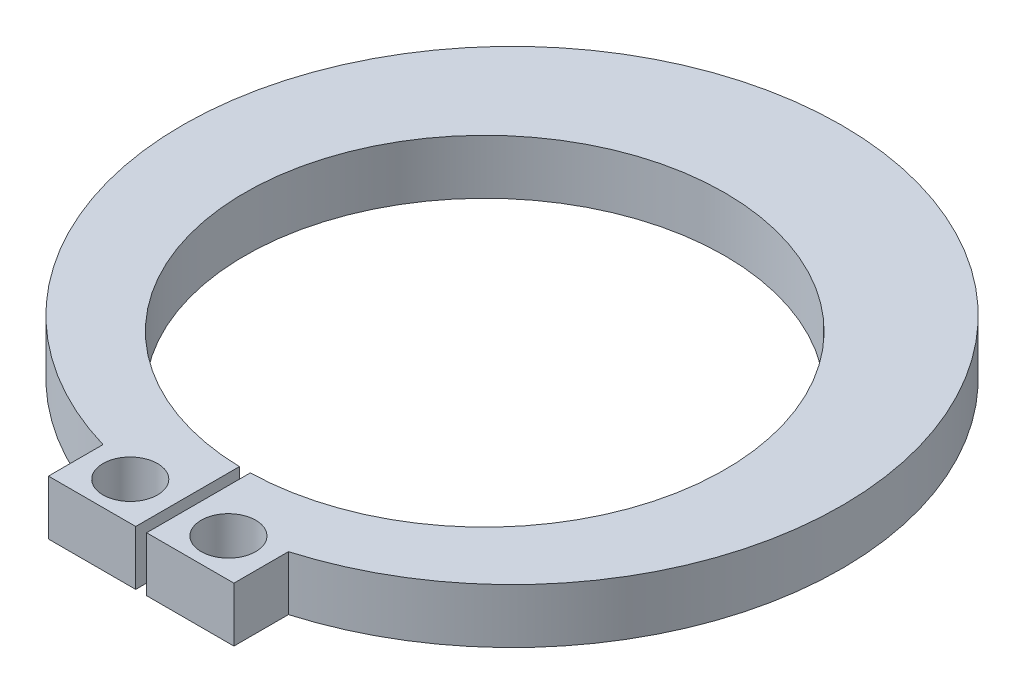
ISO-10303-21;
HEADER;
FILE_DESCRIPTION(('STEP AP214'),'2;1');
FILE_NAME('part.step','',(''),(''),'','','');
FILE_SCHEMA(('AUTOMOTIVE_DESIGN { 1 0 10303 214 1 1 1 1 }'));
ENDSEC;
DATA;
#1=APPLICATION_CONTEXT('core data for automotive mechanical design processes');
#2=APPLICATION_PROTOCOL_DEFINITION('international standard','automotive_design',2000,#1);
#3=PRODUCT_CONTEXT('',#1,'mechanical');
#4=PRODUCT('Part','Part','',(#3));
#5=PRODUCT_RELATED_PRODUCT_CATEGORY('part','',(#4));
#6=PRODUCT_DEFINITION_FORMATION('','',#4);
#7=PRODUCT_DEFINITION_CONTEXT('part definition',#1,'design');
#8=PRODUCT_DEFINITION('design','',#6,#7);
#9=PRODUCT_DEFINITION_SHAPE('','',#8);
#10=(LENGTH_UNIT() NAMED_UNIT(*) SI_UNIT(.MILLI.,.METRE.));
#11=(NAMED_UNIT(*) PLANE_ANGLE_UNIT() SI_UNIT($,.RADIAN.));
#12=(NAMED_UNIT(*) SI_UNIT($,.STERADIAN.) SOLID_ANGLE_UNIT());
#13=UNCERTAINTY_MEASURE_WITH_UNIT(LENGTH_MEASURE(1.E-05),#10,'distance_accuracy_value','');
#14=(GEOMETRIC_REPRESENTATION_CONTEXT(3) GLOBAL_UNCERTAINTY_ASSIGNED_CONTEXT((#13)) GLOBAL_UNIT_ASSIGNED_CONTEXT((#10,
#11,#12)) REPRESENTATION_CONTEXT('',''));
#15=CARTESIAN_POINT('',(0.,0.,0.));
#16=DIRECTION('',(0.,0.,1.));
#17=DIRECTION('',(1.,0.,0.));
#18=AXIS2_PLACEMENT_3D('',#15,#16,#17);
#19=CARTESIAN_POINT('',(0.,1.,0.));
#20=DIRECTION('',(0.,1.,0.));
#21=DIRECTION('',(0.,0.,1.));
#22=AXIS2_PLACEMENT_3D('',#19,#20,#21);
#23=PLANE('',#22);
#24=CARTESIAN_POINT('',(-0.9,1.,6.1));
#25=DIRECTION('',(0.,1.,0.));
#26=DIRECTION('',(0.,0.,1.));
#27=AXIS2_PLACEMENT_3D('',#24,#25,#26);
#28=CIRCLE('',#27,0.5);
#29=CARTESIAN_POINT('',(-0.9,1.,6.6));
#30=VERTEX_POINT('',#29);
#31=EDGE_CURVE('E135',#30,#30,#28,.T.);
#32=ORIENTED_EDGE('',*,*,#31,.F.);
#33=EDGE_LOOP('',(#32));
#34=FACE_BOUND('',#33,.T.);
#35=DIRECTION('',(0.,0.,1.));
#36=VECTOR('',#35,1.);
#37=CARTESIAN_POINT('',(-1.7,1.,6.8));
#38=LINE('',#37,#36);
#39=CARTESIAN_POINT('',(-1.7,1.,5.8));
#40=VERTEX_POINT('',#39);
#41=CARTESIAN_POINT('',(-1.7,1.,6.8));
#42=VERTEX_POINT('',#41);
#43=EDGE_CURVE('E146',#40,#42,#38,.T.);
#44=ORIENTED_EDGE('',*,*,#43,.T.);
#45=DIRECTION('',(1.,0.,0.));
#46=VECTOR('',#45,1.);
#47=CARTESIAN_POINT('',(-1.7,1.,6.8));
#48=LINE('',#47,#46);
#49=CARTESIAN_POINT('',(-0.1,1.,6.8));
#50=VERTEX_POINT('',#49);
#51=EDGE_CURVE('E94',#42,#50,#48,.T.);
#52=ORIENTED_EDGE('',*,*,#51,.T.);
#53=DIRECTION('',(0.,0.,-1.));
#54=VECTOR('',#53,1.);
#55=CARTESIAN_POINT('',(-0.1,1.,6.8));
#56=LINE('',#55,#54);
#57=CARTESIAN_POINT('',(-0.1,1.,4.89886348958455));
#58=VERTEX_POINT('',#57);
#59=EDGE_CURVE('E161',#50,#58,#56,.T.);
#60=ORIENTED_EDGE('',*,*,#59,.T.);
#61=CARTESIAN_POINT('',(0.,1.,0.5));
#62=DIRECTION('',(0.,-1.,0.));
#63=DIRECTION('',(0.,0.,1.));
#64=AXIS2_PLACEMENT_3D('',#61,#62,#63);
#65=CIRCLE('',#64,4.4);
#66=CARTESIAN_POINT('',(0.1,1.,4.89886348958456));
#67=VERTEX_POINT('',#66);
#68=EDGE_CURVE('E174',#58,#67,#65,.T.);
#69=ORIENTED_EDGE('',*,*,#68,.T.);
#70=DIRECTION('',(0.,0.,1.));
#71=VECTOR('',#70,1.);
#72=CARTESIAN_POINT('',(0.1,1.,6.8));
#73=LINE('',#72,#71);
#74=CARTESIAN_POINT('',(0.1,1.,6.8));
#75=VERTEX_POINT('',#74);
#76=EDGE_CURVE('E113',#67,#75,#73,.T.);
#77=ORIENTED_EDGE('',*,*,#76,.T.);
#78=DIRECTION('',(1.,0.,0.));
#79=VECTOR('',#78,1.);
#80=CARTESIAN_POINT('',(0.1,1.,6.8));
#81=LINE('',#80,#79);
#82=CARTESIAN_POINT('',(1.7,1.,6.8));
#83=VERTEX_POINT('',#82);
#84=EDGE_CURVE('E107',#75,#83,#81,.T.);
#85=ORIENTED_EDGE('',*,*,#84,.T.);
#86=DIRECTION('',(0.,0.,-1.));
#87=VECTOR('',#86,1.);
#88=CARTESIAN_POINT('',(1.7,1.,6.8));
#89=LINE('',#88,#87);
#90=CARTESIAN_POINT('',(1.7,1.,5.8));
#91=VERTEX_POINT('',#90);
#92=EDGE_CURVE('E111',#83,#91,#89,.T.);
#93=ORIENTED_EDGE('',*,*,#92,.T.);
#94=CARTESIAN_POINT('',(0.,1.,0.));
#95=DIRECTION('',(0.,1.,0.));
#96=DIRECTION('',(0.,0.,1.));
#97=AXIS2_PLACEMENT_3D('',#94,#95,#96);
#98=CIRCLE('',#97,6.04400529450463);
#99=EDGE_CURVE('E51',#91,#40,#98,.T.);
#100=ORIENTED_EDGE('',*,*,#99,.T.);
#101=EDGE_LOOP('',(#44,#52,#60,#69,#77,#85,#93,#100));
#102=FACE_BOUND('',#101,.T.);
#103=CARTESIAN_POINT('',(0.9,1.,6.1));
#104=DIRECTION('',(0.,1.,0.));
#105=DIRECTION('',(0.,0.,-1.));
#106=AXIS2_PLACEMENT_3D('',#103,#104,#105);
#107=CIRCLE('',#106,0.5);
#108=CARTESIAN_POINT('',(0.9,1.,5.6));
#109=VERTEX_POINT('',#108);
#110=EDGE_CURVE('E183',#109,#109,#107,.T.);
#111=ORIENTED_EDGE('',*,*,#110,.F.);
#112=EDGE_LOOP('',(#111));
#113=FACE_BOUND('',#112,.T.);
#114=ADVANCED_FACE('F34',(#34,#102,#113),#23,.T.);
#115=CARTESIAN_POINT('',(0.,0.,0.));
#116=DIRECTION('',(0.,1.,0.));
#117=DIRECTION('',(0.,0.,1.));
#118=AXIS2_PLACEMENT_3D('',#115,#116,#117);
#119=PLANE('',#118);
#120=DIRECTION('',(0.,0.,1.));
#121=VECTOR('',#120,1.);
#122=CARTESIAN_POINT('',(-1.7,0.,6.8));
#123=LINE('',#122,#121);
#124=CARTESIAN_POINT('',(-1.7,0.,5.8));
#125=VERTEX_POINT('',#124);
#126=CARTESIAN_POINT('',(-1.7,0.,6.8));
#127=VERTEX_POINT('',#126);
#128=EDGE_CURVE('E131',#125,#127,#123,.T.);
#129=ORIENTED_EDGE('',*,*,#128,.F.);
#130=CARTESIAN_POINT('',(0.,0.,0.));
#131=DIRECTION('',(0.,1.,0.));
#132=DIRECTION('',(0.,0.,1.));
#133=AXIS2_PLACEMENT_3D('',#130,#131,#132);
#134=CIRCLE('',#133,6.04400529450463);
#135=CARTESIAN_POINT('',(1.7,0.,5.8));
#136=VERTEX_POINT('',#135);
#137=EDGE_CURVE('E86',#136,#125,#134,.T.);
#138=ORIENTED_EDGE('',*,*,#137,.F.);
#139=DIRECTION('',(0.,0.,-1.));
#140=VECTOR('',#139,1.);
#141=CARTESIAN_POINT('',(1.7,0.,6.8));
#142=LINE('',#141,#140);
#143=CARTESIAN_POINT('',(1.7,0.,6.8));
#144=VERTEX_POINT('',#143);
#145=EDGE_CURVE('E80',#144,#136,#142,.T.);
#146=ORIENTED_EDGE('',*,*,#145,.F.);
#147=DIRECTION('',(1.,0.,0.));
#148=VECTOR('',#147,1.);
#149=CARTESIAN_POINT('',(0.1,0.,6.8));
#150=LINE('',#149,#148);
#151=CARTESIAN_POINT('',(0.1,0.,6.8));
#152=VERTEX_POINT('',#151);
#153=EDGE_CURVE('E121',#152,#144,#150,.T.);
#154=ORIENTED_EDGE('',*,*,#153,.F.);
#155=DIRECTION('',(0.,0.,1.));
#156=VECTOR('',#155,1.);
#157=CARTESIAN_POINT('',(0.1,0.,6.8));
#158=LINE('',#157,#156);
#159=CARTESIAN_POINT('',(0.1,0.,4.89886348958456));
#160=VERTEX_POINT('',#159);
#161=EDGE_CURVE('E141',#160,#152,#158,.T.);
#162=ORIENTED_EDGE('',*,*,#161,.F.);
#163=CARTESIAN_POINT('',(0.,0.,0.5));
#164=DIRECTION('',(0.,-1.,0.));
#165=DIRECTION('',(0.,0.,1.));
#166=AXIS2_PLACEMENT_3D('',#163,#164,#165);
#167=CIRCLE('',#166,4.4);
#168=CARTESIAN_POINT('',(-0.1,0.,4.89886348958455));
#169=VERTEX_POINT('',#168);
#170=EDGE_CURVE('E139',#169,#160,#167,.T.);
#171=ORIENTED_EDGE('',*,*,#170,.F.);
#172=DIRECTION('',(0.,0.,-1.));
#173=VECTOR('',#172,1.);
#174=CARTESIAN_POINT('',(-0.1,0.,6.8));
#175=LINE('',#174,#173);
#176=CARTESIAN_POINT('',(-0.1,0.,6.8));
#177=VERTEX_POINT('',#176);
#178=EDGE_CURVE('E137',#177,#169,#175,.T.);
#179=ORIENTED_EDGE('',*,*,#178,.F.);
#180=DIRECTION('',(1.,0.,0.));
#181=VECTOR('',#180,1.);
#182=CARTESIAN_POINT('',(-1.7,0.,6.8));
#183=LINE('',#182,#181);
#184=EDGE_CURVE('E134',#127,#177,#183,.T.);
#185=ORIENTED_EDGE('',*,*,#184,.F.);
#186=EDGE_LOOP('',(#129,#138,#146,#154,#162,#171,#179,#185));
#187=FACE_BOUND('',#186,.T.);
#188=CARTESIAN_POINT('',(-0.9,0.,6.1));
#189=DIRECTION('',(0.,1.,0.));
#190=DIRECTION('',(0.,0.,1.));
#191=AXIS2_PLACEMENT_3D('',#188,#189,#190);
#192=CIRCLE('',#191,0.5);
#193=CARTESIAN_POINT('',(-0.9,0.,6.6));
#194=VERTEX_POINT('',#193);
#195=EDGE_CURVE('E180',#194,#194,#192,.T.);
#196=ORIENTED_EDGE('',*,*,#195,.T.);
#197=EDGE_LOOP('',(#196));
#198=FACE_BOUND('',#197,.T.);
#199=CARTESIAN_POINT('',(0.9,0.,6.1));
#200=DIRECTION('',(0.,1.,0.));
#201=DIRECTION('',(0.,0.,-1.));
#202=AXIS2_PLACEMENT_3D('',#199,#200,#201);
#203=CIRCLE('',#202,0.5);
#204=CARTESIAN_POINT('',(0.9,0.,5.6));
#205=VERTEX_POINT('',#204);
#206=EDGE_CURVE('E186',#205,#205,#203,.T.);
#207=ORIENTED_EDGE('',*,*,#206,.T.);
#208=EDGE_LOOP('',(#207));
#209=FACE_BOUND('',#208,.T.);
#210=ADVANCED_FACE('F165',(#187,#198,#209),#119,.F.);
#211=CARTESIAN_POINT('',(-1.7,1.,6.8));
#212=DIRECTION('',(1.,0.,0.));
#213=DIRECTION('',(0.,0.,-1.));
#214=AXIS2_PLACEMENT_3D('',#211,#212,#213);
#215=PLANE('',#214);
#216=ORIENTED_EDGE('',*,*,#128,.T.);
#217=DIRECTION('',(0.,-1.,0.));
#218=VECTOR('',#217,1.);
#219=CARTESIAN_POINT('',(-1.7,1.,6.8));
#220=LINE('',#219,#218);
#221=EDGE_CURVE('E11',#42,#127,#220,.T.);
#222=ORIENTED_EDGE('',*,*,#221,.F.);
#223=ORIENTED_EDGE('',*,*,#43,.F.);
#224=DIRECTION('',(0.,-1.,0.));
#225=VECTOR('',#224,1.);
#226=CARTESIAN_POINT('',(-1.7,1.,5.8));
#227=LINE('',#226,#225);
#228=EDGE_CURVE('E127',#40,#125,#227,.T.);
#229=ORIENTED_EDGE('',*,*,#228,.T.);
#230=EDGE_LOOP('',(#216,#222,#223,#229));
#231=FACE_BOUND('',#230,.T.);
#232=ADVANCED_FACE('F36',(#231),#215,.F.);
#233=CARTESIAN_POINT('',(-1.7,1.,6.8));
#234=DIRECTION('',(0.,0.,-1.));
#235=DIRECTION('',(-1.,0.,0.));
#236=AXIS2_PLACEMENT_3D('',#233,#234,#235);
#237=PLANE('',#236);
#238=ORIENTED_EDGE('',*,*,#184,.T.);
#239=DIRECTION('',(0.,-1.,0.));
#240=VECTOR('',#239,1.);
#241=CARTESIAN_POINT('',(-0.1,1.,6.8));
#242=LINE('',#241,#240);
#243=EDGE_CURVE('E43',#50,#177,#242,.T.);
#244=ORIENTED_EDGE('',*,*,#243,.F.);
#245=ORIENTED_EDGE('',*,*,#51,.F.);
#246=ORIENTED_EDGE('',*,*,#221,.T.);
#247=EDGE_LOOP('',(#238,#244,#245,#246));
#248=FACE_BOUND('',#247,.T.);
#249=ADVANCED_FACE('F218',(#248),#237,.F.);
#250=CARTESIAN_POINT('',(-0.1,1.,6.8));
#251=DIRECTION('',(-1.,0.,0.));
#252=DIRECTION('',(0.,0.,1.));
#253=AXIS2_PLACEMENT_3D('',#250,#251,#252);
#254=PLANE('',#253);
#255=ORIENTED_EDGE('',*,*,#178,.T.);
#256=DIRECTION('',(0.,-1.,0.));
#257=VECTOR('',#256,1.);
#258=CARTESIAN_POINT('',(-0.1,1.,4.89886348958455));
#259=LINE('',#258,#257);
#260=EDGE_CURVE('E153',#58,#169,#259,.T.);
#261=ORIENTED_EDGE('',*,*,#260,.F.);
#262=ORIENTED_EDGE('',*,*,#59,.F.);
#263=ORIENTED_EDGE('',*,*,#243,.T.);
#264=EDGE_LOOP('',(#255,#261,#262,#263));
#265=FACE_BOUND('',#264,.T.);
#266=ADVANCED_FACE('F159',(#265),#254,.F.);
#267=CARTESIAN_POINT('',(0.,1.,0.5));
#268=DIRECTION('',(0.,-1.,0.));
#269=DIRECTION('',(0.,0.,-1.));
#270=AXIS2_PLACEMENT_3D('',#267,#268,#269);
#271=CYLINDRICAL_SURFACE('',#270,4.4);
#272=ORIENTED_EDGE('',*,*,#170,.T.);
#273=DIRECTION('',(0.,-1.,0.));
#274=VECTOR('',#273,1.);
#275=CARTESIAN_POINT('',(0.1,1.,4.89886348958456));
#276=LINE('',#275,#274);
#277=EDGE_CURVE('E150',#67,#160,#276,.T.);
#278=ORIENTED_EDGE('',*,*,#277,.F.);
#279=ORIENTED_EDGE('',*,*,#68,.F.);
#280=ORIENTED_EDGE('',*,*,#260,.T.);
#281=EDGE_LOOP('',(#272,#278,#279,#280));
#282=FACE_BOUND('',#281,.T.);
#283=ADVANCED_FACE('F170',(#282),#271,.F.);
#284=CARTESIAN_POINT('',(0.1,1.,6.8));
#285=DIRECTION('',(1.,0.,0.));
#286=DIRECTION('',(0.,0.,-1.));
#287=AXIS2_PLACEMENT_3D('',#284,#285,#286);
#288=PLANE('',#287);
#289=ORIENTED_EDGE('',*,*,#161,.T.);
#290=DIRECTION('',(0.,-1.,0.));
#291=VECTOR('',#290,1.);
#292=CARTESIAN_POINT('',(0.1,1.,6.8));
#293=LINE('',#292,#291);
#294=EDGE_CURVE('E122',#75,#152,#293,.T.);
#295=ORIENTED_EDGE('',*,*,#294,.F.);
#296=ORIENTED_EDGE('',*,*,#76,.F.);
#297=ORIENTED_EDGE('',*,*,#277,.T.);
#298=EDGE_LOOP('',(#289,#295,#296,#297));
#299=FACE_BOUND('',#298,.T.);
#300=ADVANCED_FACE('F173',(#299),#288,.F.);
#301=CARTESIAN_POINT('',(0.1,1.,6.8));
#302=DIRECTION('',(0.,0.,-1.));
#303=DIRECTION('',(-1.,0.,0.));
#304=AXIS2_PLACEMENT_3D('',#301,#302,#303);
#305=PLANE('',#304);
#306=ORIENTED_EDGE('',*,*,#153,.T.);
#307=DIRECTION('',(0.,-1.,0.));
#308=VECTOR('',#307,1.);
#309=CARTESIAN_POINT('',(1.7,1.,6.8));
#310=LINE('',#309,#308);
#311=EDGE_CURVE('E118',#83,#144,#310,.T.);
#312=ORIENTED_EDGE('',*,*,#311,.F.);
#313=ORIENTED_EDGE('',*,*,#84,.F.);
#314=ORIENTED_EDGE('',*,*,#294,.T.);
#315=EDGE_LOOP('',(#306,#312,#313,#314));
#316=FACE_BOUND('',#315,.T.);
#317=ADVANCED_FACE('F119',(#316),#305,.F.);
#318=CARTESIAN_POINT('',(1.7,1.,6.8));
#319=DIRECTION('',(-1.,0.,0.));
#320=DIRECTION('',(0.,0.,1.));
#321=AXIS2_PLACEMENT_3D('',#318,#319,#320);
#322=PLANE('',#321);
#323=ORIENTED_EDGE('',*,*,#145,.T.);
#324=DIRECTION('',(0.,-1.,0.));
#325=VECTOR('',#324,1.);
#326=CARTESIAN_POINT('',(1.7,1.,5.8));
#327=LINE('',#326,#325);
#328=EDGE_CURVE('E123',#91,#136,#327,.T.);
#329=ORIENTED_EDGE('',*,*,#328,.F.);
#330=ORIENTED_EDGE('',*,*,#92,.F.);
#331=ORIENTED_EDGE('',*,*,#311,.T.);
#332=EDGE_LOOP('',(#323,#329,#330,#331));
#333=FACE_BOUND('',#332,.T.);
#334=ADVANCED_FACE('F125',(#333),#322,.F.);
#335=CARTESIAN_POINT('',(0.,1.,0.));
#336=DIRECTION('',(0.,-1.,0.));
#337=DIRECTION('',(0.,0.,-1.));
#338=AXIS2_PLACEMENT_3D('',#335,#336,#337);
#339=CYLINDRICAL_SURFACE('',#338,6.04400529450463);
#340=ORIENTED_EDGE('',*,*,#137,.T.);
#341=ORIENTED_EDGE('',*,*,#228,.F.);
#342=ORIENTED_EDGE('',*,*,#99,.F.);
#343=ORIENTED_EDGE('',*,*,#328,.T.);
#344=EDGE_LOOP('',(#340,#341,#342,#343));
#345=FACE_BOUND('',#344,.T.);
#346=ADVANCED_FACE('F206',(#345),#339,.T.);
#347=CARTESIAN_POINT('',(-0.9,1.,6.1));
#348=DIRECTION('',(0.,-1.,0.));
#349=DIRECTION('',(0.,0.,-1.));
#350=AXIS2_PLACEMENT_3D('',#347,#348,#349);
#351=CYLINDRICAL_SURFACE('',#350,0.5);
#352=ORIENTED_EDGE('',*,*,#31,.T.);
#353=EDGE_LOOP('',(#352));
#354=FACE_BOUND('',#353,.T.);
#355=ORIENTED_EDGE('',*,*,#195,.F.);
#356=EDGE_LOOP('',(#355));
#357=FACE_BOUND('',#356,.T.);
#358=ADVANCED_FACE('F203',(#354,#357),#351,.F.);
#359=CARTESIAN_POINT('',(0.9,1.,6.1));
#360=DIRECTION('',(0.,-1.,0.));
#361=DIRECTION('',(0.,0.,-1.));
#362=AXIS2_PLACEMENT_3D('',#359,#360,#361);
#363=CYLINDRICAL_SURFACE('',#362,0.5);
#364=ORIENTED_EDGE('',*,*,#110,.T.);
#365=EDGE_LOOP('',(#364));
#366=FACE_BOUND('',#365,.T.);
#367=ORIENTED_EDGE('',*,*,#206,.F.);
#368=EDGE_LOOP('',(#367));
#369=FACE_BOUND('',#368,.T.);
#370=ADVANCED_FACE('F192',(#366,#369),#363,.F.);
#371=CLOSED_SHELL('',(#114,#210,#232,#249,#266,#283,#300,#317,#334,#346,#358,#370));
#372=MANIFOLD_SOLID_BREP('B2',#371);
#373=ADVANCED_BREP_SHAPE_REPRESENTATION('',(#18,#372),#14);
#374=SHAPE_DEFINITION_REPRESENTATION(#9,#373);
ENDSEC;
END-ISO-10303-21;
